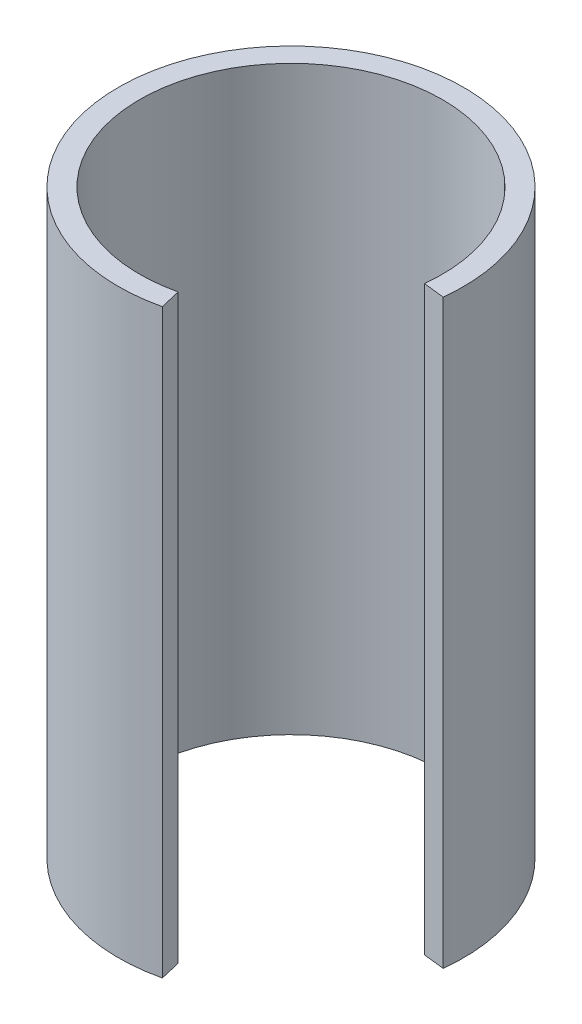
ISO-10303-21;
HEADER;
FILE_DESCRIPTION(('STEP AP214'),'2;1');
FILE_NAME('part.step','',(''),(''),'','','');
FILE_SCHEMA(('AUTOMOTIVE_DESIGN { 1 0 10303 214 1 1 1 1 }'));
ENDSEC;
DATA;
#1=APPLICATION_CONTEXT('core data for automotive mechanical design processes');
#2=APPLICATION_PROTOCOL_DEFINITION('international standard','automotive_design',2000,#1);
#3=PRODUCT_CONTEXT('',#1,'mechanical');
#4=PRODUCT('Part','Part','',(#3));
#5=PRODUCT_RELATED_PRODUCT_CATEGORY('part','',(#4));
#6=PRODUCT_DEFINITION_FORMATION('','',#4);
#7=PRODUCT_DEFINITION_CONTEXT('part definition',#1,'design');
#8=PRODUCT_DEFINITION('design','',#6,#7);
#9=PRODUCT_DEFINITION_SHAPE('','',#8);
#10=(LENGTH_UNIT() NAMED_UNIT(*) SI_UNIT(.MILLI.,.METRE.));
#11=(NAMED_UNIT(*) PLANE_ANGLE_UNIT() SI_UNIT($,.RADIAN.));
#12=(NAMED_UNIT(*) SI_UNIT($,.STERADIAN.) SOLID_ANGLE_UNIT());
#13=UNCERTAINTY_MEASURE_WITH_UNIT(LENGTH_MEASURE(1.E-05),#10,'distance_accuracy_value','');
#14=(GEOMETRIC_REPRESENTATION_CONTEXT(3) GLOBAL_UNCERTAINTY_ASSIGNED_CONTEXT((#13)) GLOBAL_UNIT_ASSIGNED_CONTEXT((#10,
#11,#12)) REPRESENTATION_CONTEXT('',''));
#15=CARTESIAN_POINT('',(0.,0.,0.));
#16=DIRECTION('',(0.,0.,1.));
#17=DIRECTION('',(1.,0.,0.));
#18=AXIS2_PLACEMENT_3D('',#15,#16,#17);
#19=CARTESIAN_POINT('',(0.,150.,0.));
#20=DIRECTION('',(0.,-1.,0.));
#21=DIRECTION('',(0.,0.,-1.));
#22=AXIS2_PLACEMENT_3D('',#19,#20,#21);
#23=CYLINDRICAL_SURFACE('',#22,39.05);
#24=CARTESIAN_POINT('',(0.,0.,0.));
#25=DIRECTION('',(0.,-1.,0.));
#26=DIRECTION('',(0.,0.,1.));
#27=AXIS2_PLACEMENT_3D('',#24,#25,#26);
#28=CIRCLE('',#27,39.05);
#29=CARTESIAN_POINT('',(8.91643483042057,0.,38.0184125117667));
#30=VERTEX_POINT('',#29);
#31=CARTESIAN_POINT('',(38.8039121557055,0.,4.3770882344649));
#32=VERTEX_POINT('',#31);
#33=EDGE_CURVE('E96',#30,#32,#28,.T.);
#34=ORIENTED_EDGE('',*,*,#33,.T.);
#35=DIRECTION('',(0.,-1.,0.));
#36=VECTOR('',#35,1.);
#37=CARTESIAN_POINT('',(38.8039121557055,150.,4.3770882344649));
#38=LINE('',#37,#36);
#39=CARTESIAN_POINT('',(38.8039121557055,150.,4.3770882344649));
#40=VERTEX_POINT('',#39);
#41=EDGE_CURVE('E11',#40,#32,#38,.T.);
#42=ORIENTED_EDGE('',*,*,#41,.F.);
#43=CARTESIAN_POINT('',(0.,150.,0.));
#44=DIRECTION('',(0.,-1.,0.));
#45=DIRECTION('',(0.,0.,1.));
#46=AXIS2_PLACEMENT_3D('',#43,#44,#45);
#47=CIRCLE('',#46,39.05);
#48=CARTESIAN_POINT('',(8.91643483042057,150.,38.0184125117667));
#49=VERTEX_POINT('',#48);
#50=EDGE_CURVE('E84',#49,#40,#47,.T.);
#51=ORIENTED_EDGE('',*,*,#50,.F.);
#52=DIRECTION('',(0.,-1.,0.));
#53=VECTOR('',#52,1.);
#54=CARTESIAN_POINT('',(8.91643483042057,150.,38.0184125117667));
#55=LINE('',#54,#53);
#56=EDGE_CURVE('E92',#49,#30,#55,.T.);
#57=ORIENTED_EDGE('',*,*,#56,.T.);
#58=EDGE_LOOP('',(#34,#42,#51,#57));
#59=FACE_BOUND('',#58,.T.);
#60=ADVANCED_FACE('F33',(#59),#23,.F.);
#61=CARTESIAN_POINT('',(38.8039121557055,150.,4.3770882344649));
#62=DIRECTION('',(0.112089327387065,0.,-0.993698134589129));
#63=DIRECTION('',(-0.993698134589129,0.,-0.112089327387065));
#64=AXIS2_PLACEMENT_3D('',#61,#62,#63);
#65=PLANE('',#64);
#66=DIRECTION('',(0.993698134589129,0.,0.112089327387065));
#67=VECTOR('',#66,1.);
#68=CARTESIAN_POINT('',(38.8039121557055,0.,4.3770882344649));
#69=LINE('',#68,#67);
#70=CARTESIAN_POINT('',(44.2456306706936,0.,4.9909150566587));
#71=VERTEX_POINT('',#70);
#72=EDGE_CURVE('E88',#32,#71,#69,.T.);
#73=ORIENTED_EDGE('',*,*,#72,.T.);
#74=DIRECTION('',(0.,-1.,0.));
#75=VECTOR('',#74,1.);
#76=CARTESIAN_POINT('',(44.2456306706936,150.,4.9909150566587));
#77=LINE('',#76,#75);
#78=CARTESIAN_POINT('',(44.2456306706936,150.,4.9909150566587));
#79=VERTEX_POINT('',#78);
#80=EDGE_CURVE('E41',#79,#71,#77,.T.);
#81=ORIENTED_EDGE('',*,*,#80,.F.);
#82=DIRECTION('',(0.993698134589129,0.,0.112089327387065));
#83=VECTOR('',#82,1.);
#84=CARTESIAN_POINT('',(38.8039121557055,150.,4.3770882344649));
#85=LINE('',#84,#83);
#86=EDGE_CURVE('E79',#40,#79,#85,.T.);
#87=ORIENTED_EDGE('',*,*,#86,.F.);
#88=ORIENTED_EDGE('',*,*,#41,.T.);
#89=EDGE_LOOP('',(#73,#81,#87,#88));
#90=FACE_BOUND('',#89,.T.);
#91=ADVANCED_FACE('F87',(#90),#65,.F.);
#92=CARTESIAN_POINT('',(0.,150.,0.));
#93=DIRECTION('',(0.,-1.,0.));
#94=DIRECTION('',(0.,0.,-1.));
#95=AXIS2_PLACEMENT_3D('',#92,#93,#94);
#96=CYLINDRICAL_SURFACE('',#95,44.5262289729346);
#97=CARTESIAN_POINT('',(0.,0.,0.));
#98=DIRECTION('',(0.,1.,0.));
#99=DIRECTION('',(0.,0.,1.));
#100=AXIS2_PLACEMENT_3D('',#97,#98,#99);
#101=CIRCLE('',#100,44.5262289729346);
#102=CARTESIAN_POINT('',(10.1668429931256,0.,43.3499754337108));
#103=VERTEX_POINT('',#102);
#104=EDGE_CURVE('E66',#71,#103,#101,.T.);
#105=ORIENTED_EDGE('',*,*,#104,.T.);
#106=DIRECTION('',(0.,-1.,0.));
#107=VECTOR('',#106,1.);
#108=CARTESIAN_POINT('',(10.1668429931256,150.,43.3499754337108));
#109=LINE('',#108,#107);
#110=CARTESIAN_POINT('',(10.1668429931256,150.,43.3499754337108));
#111=VERTEX_POINT('',#110);
#112=EDGE_CURVE('E89',#111,#103,#109,.T.);
#113=ORIENTED_EDGE('',*,*,#112,.F.);
#114=CARTESIAN_POINT('',(0.,150.,0.));
#115=DIRECTION('',(0.,1.,0.));
#116=DIRECTION('',(0.,0.,1.));
#117=AXIS2_PLACEMENT_3D('',#114,#115,#116);
#118=CIRCLE('',#117,44.5262289729346);
#119=EDGE_CURVE('E82',#79,#111,#118,.T.);
#120=ORIENTED_EDGE('',*,*,#119,.F.);
#121=ORIENTED_EDGE('',*,*,#80,.T.);
#122=EDGE_LOOP('',(#105,#113,#120,#121));
#123=FACE_BOUND('',#122,.T.);
#124=ADVANCED_FACE('F90',(#123),#96,.T.);
#125=CARTESIAN_POINT('',(8.91643483042057,150.,38.0184125117667));
#126=DIRECTION('',(-0.973582906831415,0.,0.228333798474278));
#127=DIRECTION('',(0.228333798474278,0.,0.973582906831415));
#128=AXIS2_PLACEMENT_3D('',#125,#126,#127);
#129=PLANE('',#128);
#130=DIRECTION('',(-0.228333798474278,0.,-0.973582906831415));
#131=VECTOR('',#130,1.);
#132=CARTESIAN_POINT('',(8.91643483042057,0.,38.0184125117667));
#133=LINE('',#132,#131);
#134=EDGE_CURVE('E72',#103,#30,#133,.T.);
#135=ORIENTED_EDGE('',*,*,#134,.T.);
#136=ORIENTED_EDGE('',*,*,#56,.F.);
#137=DIRECTION('',(-0.228333798474278,0.,-0.973582906831415));
#138=VECTOR('',#137,1.);
#139=CARTESIAN_POINT('',(8.91643483042057,150.,38.0184125117667));
#140=LINE('',#139,#138);
#141=EDGE_CURVE('E49',#111,#49,#140,.T.);
#142=ORIENTED_EDGE('',*,*,#141,.F.);
#143=ORIENTED_EDGE('',*,*,#112,.T.);
#144=EDGE_LOOP('',(#135,#136,#142,#143));
#145=FACE_BOUND('',#144,.T.);
#146=ADVANCED_FACE('F103',(#145),#129,.F.);
#147=CARTESIAN_POINT('',(0.,150.,0.));
#148=DIRECTION('',(0.,1.,0.));
#149=DIRECTION('',(0.,0.,1.));
#150=AXIS2_PLACEMENT_3D('',#147,#148,#149);
#151=PLANE('',#150);
#152=ORIENTED_EDGE('',*,*,#50,.T.);
#153=ORIENTED_EDGE('',*,*,#86,.T.);
#154=ORIENTED_EDGE('',*,*,#119,.T.);
#155=ORIENTED_EDGE('',*,*,#141,.T.);
#156=EDGE_LOOP('',(#152,#153,#154,#155));
#157=FACE_BOUND('',#156,.T.);
#158=ADVANCED_FACE('F80',(#157),#151,.T.);
#159=CARTESIAN_POINT('',(0.,0.,0.));
#160=DIRECTION('',(0.,1.,0.));
#161=DIRECTION('',(0.,0.,1.));
#162=AXIS2_PLACEMENT_3D('',#159,#160,#161);
#163=PLANE('',#162);
#164=ORIENTED_EDGE('',*,*,#33,.F.);
#165=ORIENTED_EDGE('',*,*,#134,.F.);
#166=ORIENTED_EDGE('',*,*,#104,.F.);
#167=ORIENTED_EDGE('',*,*,#72,.F.);
#168=EDGE_LOOP('',(#164,#165,#166,#167));
#169=FACE_BOUND('',#168,.T.);
#170=ADVANCED_FACE('F106',(#169),#163,.F.);
#171=CLOSED_SHELL('',(#60,#91,#124,#146,#158,#170));
#172=MANIFOLD_SOLID_BREP('B2',#171);
#173=ADVANCED_BREP_SHAPE_REPRESENTATION('',(#18,#172),#14);
#174=SHAPE_DEFINITION_REPRESENTATION(#9,#173);
ENDSEC;
END-ISO-10303-21;
